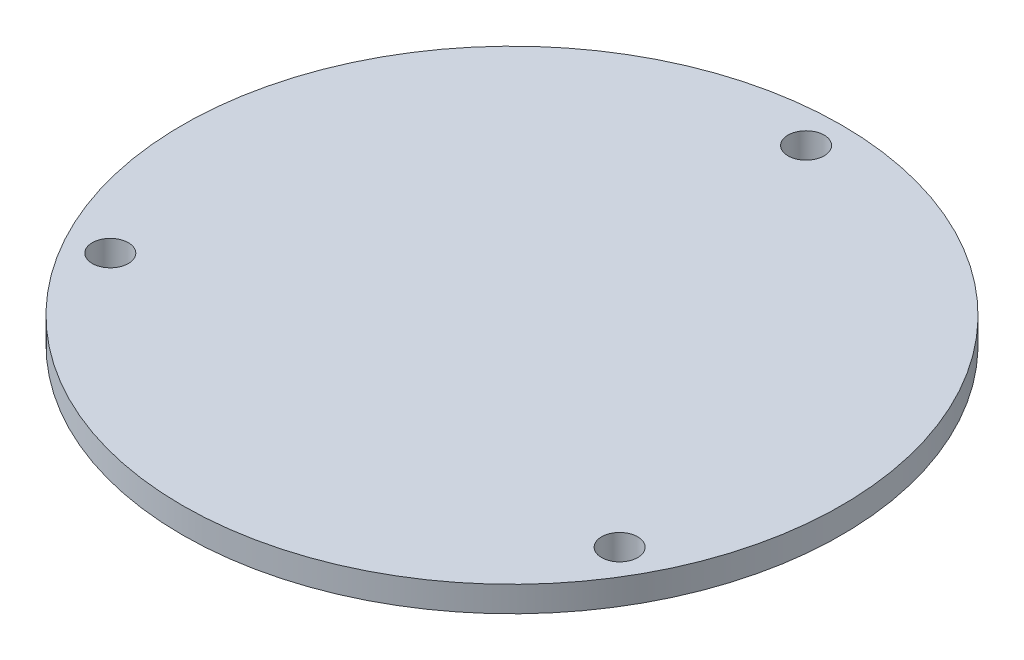
ISO-10303-21;
HEADER;
FILE_DESCRIPTION(('STEP AP214'),'2;1');
FILE_NAME('part.step','',(''),(''),'','','');
FILE_SCHEMA(('AUTOMOTIVE_DESIGN { 1 0 10303 214 1 1 1 1 }'));
ENDSEC;
DATA;
#1=APPLICATION_CONTEXT('core data for automotive mechanical design processes');
#2=APPLICATION_PROTOCOL_DEFINITION('international standard','automotive_design',2000,#1);
#3=PRODUCT_CONTEXT('',#1,'mechanical');
#4=PRODUCT('Part','Part','',(#3));
#5=PRODUCT_RELATED_PRODUCT_CATEGORY('part','',(#4));
#6=PRODUCT_DEFINITION_FORMATION('','',#4);
#7=PRODUCT_DEFINITION_CONTEXT('part definition',#1,'design');
#8=PRODUCT_DEFINITION('design','',#6,#7);
#9=PRODUCT_DEFINITION_SHAPE('','',#8);
#10=(LENGTH_UNIT() NAMED_UNIT(*) SI_UNIT(.MILLI.,.METRE.));
#11=(NAMED_UNIT(*) PLANE_ANGLE_UNIT() SI_UNIT($,.RADIAN.));
#12=(NAMED_UNIT(*) SI_UNIT($,.STERADIAN.) SOLID_ANGLE_UNIT());
#13=UNCERTAINTY_MEASURE_WITH_UNIT(LENGTH_MEASURE(1.E-05),#10,'distance_accuracy_value','');
#14=(GEOMETRIC_REPRESENTATION_CONTEXT(3) GLOBAL_UNCERTAINTY_ASSIGNED_CONTEXT((#13)) GLOBAL_UNIT_ASSIGNED_CONTEXT((#10,
#11,#12)) REPRESENTATION_CONTEXT('',''));
#15=CARTESIAN_POINT('',(0.,0.,0.));
#16=DIRECTION('',(0.,0.,1.));
#17=DIRECTION('',(1.,0.,0.));
#18=AXIS2_PLACEMENT_3D('',#15,#16,#17);
#19=CARTESIAN_POINT('',(0.,1.6002,0.));
#20=DIRECTION('',(0.,-1.,0.));
#21=DIRECTION('',(0.,0.,-1.));
#22=AXIS2_PLACEMENT_3D('',#19,#20,#21);
#23=CYLINDRICAL_SURFACE('',#22,20.6375);
#24=CARTESIAN_POINT('',(0.,1.6002,0.));
#25=DIRECTION('',(0.,1.,0.));
#26=DIRECTION('',(0.,0.,1.));
#27=AXIS2_PLACEMENT_3D('',#24,#25,#26);
#28=CIRCLE('',#27,20.6375);
#29=CARTESIAN_POINT('',(0.,1.6002,20.6375));
#30=VERTEX_POINT('',#29);
#31=EDGE_CURVE('E11',#30,#30,#28,.T.);
#32=ORIENTED_EDGE('',*,*,#31,.F.);
#33=EDGE_LOOP('',(#32));
#34=FACE_BOUND('',#33,.T.);
#35=CARTESIAN_POINT('',(0.,0.,0.));
#36=DIRECTION('',(0.,1.,0.));
#37=DIRECTION('',(0.,0.,1.));
#38=AXIS2_PLACEMENT_3D('',#35,#36,#37);
#39=CIRCLE('',#38,20.6375);
#40=CARTESIAN_POINT('',(0.,0.,20.6375));
#41=VERTEX_POINT('',#40);
#42=EDGE_CURVE('E46',#41,#41,#39,.T.);
#43=ORIENTED_EDGE('',*,*,#42,.T.);
#44=EDGE_LOOP('',(#43));
#45=FACE_BOUND('',#44,.T.);
#46=ADVANCED_FACE('F39',(#34,#45),#23,.T.);
#47=CARTESIAN_POINT('',(0.,1.6002,0.));
#48=DIRECTION('',(0.,1.,0.));
#49=DIRECTION('',(0.,0.,1.));
#50=AXIS2_PLACEMENT_3D('',#47,#48,#49);
#51=PLANE('',#50);
#52=CARTESIAN_POINT('',(-15.9478578106893,1.6002,9.20750000000067));
#53=DIRECTION('',(0.,1.,0.));
#54=DIRECTION('',(0.,0.,1.));
#55=AXIS2_PLACEMENT_3D('',#52,#53,#54);
#56=CIRCLE('',#55,1.1303);
#57=CARTESIAN_POINT('',(-15.9478578106893,1.6002,10.3378000000007));
#58=VERTEX_POINT('',#57);
#59=EDGE_CURVE('E66',#58,#58,#56,.T.);
#60=ORIENTED_EDGE('',*,*,#59,.F.);
#61=EDGE_LOOP('',(#60));
#62=FACE_BOUND('',#61,.T.);
#63=CARTESIAN_POINT('',(15.9478578106916,1.6002,9.20749999999933));
#64=DIRECTION('',(0.,1.,0.));
#65=DIRECTION('',(0.,0.,1.));
#66=AXIS2_PLACEMENT_3D('',#63,#64,#65);
#67=CIRCLE('',#66,1.1303);
#68=CARTESIAN_POINT('',(15.9478578106916,1.6002,10.3377999999993));
#69=VERTEX_POINT('',#68);
#70=EDGE_CURVE('E63',#69,#69,#67,.T.);
#71=ORIENTED_EDGE('',*,*,#70,.F.);
#72=EDGE_LOOP('',(#71));
#73=FACE_BOUND('',#72,.T.);
#74=CARTESIAN_POINT('',(0.,1.6002,-18.415));
#75=DIRECTION('',(0.,1.,0.));
#76=DIRECTION('',(0.,0.,1.));
#77=AXIS2_PLACEMENT_3D('',#74,#75,#76);
#78=CIRCLE('',#77,1.1303);
#79=CARTESIAN_POINT('',(0.,1.6002,-17.2847));
#80=VERTEX_POINT('',#79);
#81=EDGE_CURVE('E54',#80,#80,#78,.T.);
#82=ORIENTED_EDGE('',*,*,#81,.F.);
#83=EDGE_LOOP('',(#82));
#84=FACE_BOUND('',#83,.T.);
#85=ORIENTED_EDGE('',*,*,#31,.T.);
#86=EDGE_LOOP('',(#85));
#87=FACE_BOUND('',#86,.T.);
#88=ADVANCED_FACE('F89',(#62,#73,#84,#87),#51,.T.);
#89=CARTESIAN_POINT('',(0.,0.,0.));
#90=DIRECTION('',(0.,1.,0.));
#91=DIRECTION('',(0.,0.,1.));
#92=AXIS2_PLACEMENT_3D('',#89,#90,#91);
#93=PLANE('',#92);
#94=CARTESIAN_POINT('',(-15.9478578106893,0.,9.20750000000067));
#95=DIRECTION('',(0.,1.,0.));
#96=DIRECTION('',(0.,0.,1.));
#97=AXIS2_PLACEMENT_3D('',#94,#95,#96);
#98=CIRCLE('',#97,1.1303);
#99=CARTESIAN_POINT('',(-15.9478578106893,0.,10.3378000000007));
#100=VERTEX_POINT('',#99);
#101=EDGE_CURVE('E42',#100,#100,#98,.F.);
#102=ORIENTED_EDGE('',*,*,#101,.F.);
#103=EDGE_LOOP('',(#102));
#104=FACE_BOUND('',#103,.T.);
#105=CARTESIAN_POINT('',(15.9478578106916,0.,9.20749999999933));
#106=DIRECTION('',(0.,1.,0.));
#107=DIRECTION('',(0.,0.,1.));
#108=AXIS2_PLACEMENT_3D('',#105,#106,#107);
#109=CIRCLE('',#108,1.1303);
#110=CARTESIAN_POINT('',(15.9478578106916,0.,10.3377999999993));
#111=VERTEX_POINT('',#110);
#112=EDGE_CURVE('E69',#111,#111,#109,.F.);
#113=ORIENTED_EDGE('',*,*,#112,.F.);
#114=EDGE_LOOP('',(#113));
#115=FACE_BOUND('',#114,.T.);
#116=CARTESIAN_POINT('',(0.,0.,-18.415));
#117=DIRECTION('',(0.,1.,0.));
#118=DIRECTION('',(0.,0.,1.));
#119=AXIS2_PLACEMENT_3D('',#116,#117,#118);
#120=CIRCLE('',#119,1.1303);
#121=CARTESIAN_POINT('',(0.,0.,-17.2847));
#122=VERTEX_POINT('',#121);
#123=EDGE_CURVE('E50',#122,#122,#120,.F.);
#124=ORIENTED_EDGE('',*,*,#123,.F.);
#125=EDGE_LOOP('',(#124));
#126=FACE_BOUND('',#125,.T.);
#127=ORIENTED_EDGE('',*,*,#42,.F.);
#128=EDGE_LOOP('',(#127));
#129=FACE_BOUND('',#128,.T.);
#130=ADVANCED_FACE('F86',(#104,#115,#126,#129),#93,.F.);
#131=CARTESIAN_POINT('',(0.,1.6002,-18.415));
#132=DIRECTION('',(0.,-1.,0.));
#133=DIRECTION('',(0.,0.,-1.));
#134=AXIS2_PLACEMENT_3D('',#131,#132,#133);
#135=CYLINDRICAL_SURFACE('',#134,1.1303);
#136=ORIENTED_EDGE('',*,*,#81,.T.);
#137=EDGE_LOOP('',(#136));
#138=FACE_BOUND('',#137,.T.);
#139=ORIENTED_EDGE('',*,*,#123,.T.);
#140=EDGE_LOOP('',(#139));
#141=FACE_BOUND('',#140,.T.);
#142=ADVANCED_FACE('F84',(#138,#141),#135,.F.);
#143=CARTESIAN_POINT('',(15.9478578106916,1.6002,9.20749999999933));
#144=DIRECTION('',(0.,-1.,0.));
#145=DIRECTION('',(0.,0.,-1.));
#146=AXIS2_PLACEMENT_3D('',#143,#144,#145);
#147=CYLINDRICAL_SURFACE('',#146,1.1303);
#148=ORIENTED_EDGE('',*,*,#70,.T.);
#149=EDGE_LOOP('',(#148));
#150=FACE_BOUND('',#149,.T.);
#151=ORIENTED_EDGE('',*,*,#112,.T.);
#152=EDGE_LOOP('',(#151));
#153=FACE_BOUND('',#152,.T.);
#154=ADVANCED_FACE('F106',(#150,#153),#147,.F.);
#155=CARTESIAN_POINT('',(-15.9478578106893,1.6002,9.20750000000067));
#156=DIRECTION('',(0.,-1.,0.));
#157=DIRECTION('',(0.,0.,-1.));
#158=AXIS2_PLACEMENT_3D('',#155,#156,#157);
#159=CYLINDRICAL_SURFACE('',#158,1.1303);
#160=ORIENTED_EDGE('',*,*,#59,.T.);
#161=EDGE_LOOP('',(#160));
#162=FACE_BOUND('',#161,.T.);
#163=ORIENTED_EDGE('',*,*,#101,.T.);
#164=EDGE_LOOP('',(#163));
#165=FACE_BOUND('',#164,.T.);
#166=ADVANCED_FACE('F109',(#162,#165),#159,.F.);
#167=CLOSED_SHELL('',(#46,#88,#130,#142,#154,#166));
#168=MANIFOLD_SOLID_BREP('B2',#167);
#169=ADVANCED_BREP_SHAPE_REPRESENTATION('',(#18,#168),#14);
#170=SHAPE_DEFINITION_REPRESENTATION(#9,#169);
ENDSEC;
END-ISO-10303-21;
